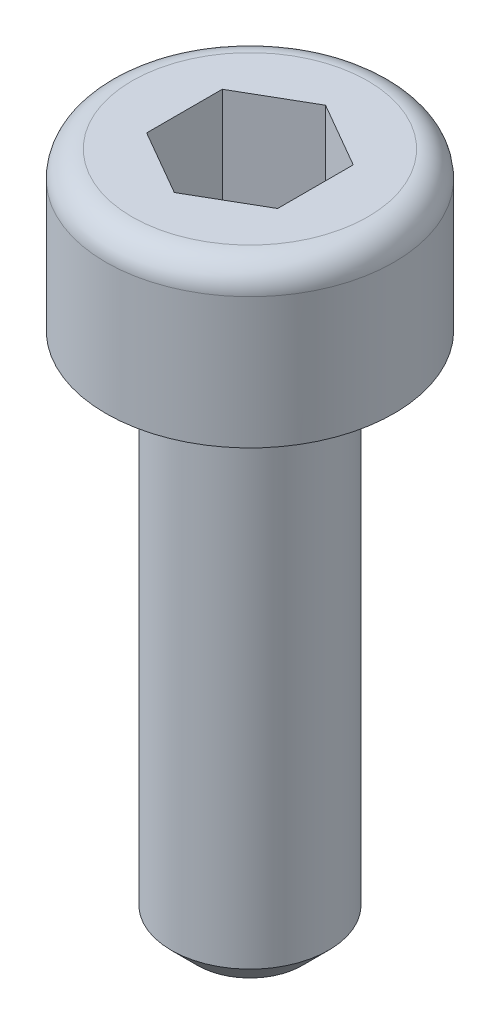
ISO-10303-21;
HEADER;
FILE_DESCRIPTION(('STEP AP214'),'2;1');
FILE_NAME('part.step','',(''),(''),'','','');
FILE_SCHEMA(('AUTOMOTIVE_DESIGN { 1 0 10303 214 1 1 1 1 }'));
ENDSEC;
DATA;
#1=APPLICATION_CONTEXT('core data for automotive mechanical design processes');
#2=APPLICATION_PROTOCOL_DEFINITION('international standard','automotive_design',2000,#1);
#3=PRODUCT_CONTEXT('',#1,'mechanical');
#4=PRODUCT('Part','Part','',(#3));
#5=PRODUCT_RELATED_PRODUCT_CATEGORY('part','',(#4));
#6=PRODUCT_DEFINITION_FORMATION('','',#4);
#7=PRODUCT_DEFINITION_CONTEXT('part definition',#1,'design');
#8=PRODUCT_DEFINITION('design','',#6,#7);
#9=PRODUCT_DEFINITION_SHAPE('','',#8);
#10=(LENGTH_UNIT() NAMED_UNIT(*) SI_UNIT(.MILLI.,.METRE.));
#11=(NAMED_UNIT(*) PLANE_ANGLE_UNIT() SI_UNIT($,.RADIAN.));
#12=(NAMED_UNIT(*) SI_UNIT($,.STERADIAN.) SOLID_ANGLE_UNIT());
#13=UNCERTAINTY_MEASURE_WITH_UNIT(LENGTH_MEASURE(1.E-05),#10,'distance_accuracy_value','');
#14=(GEOMETRIC_REPRESENTATION_CONTEXT(3) GLOBAL_UNCERTAINTY_ASSIGNED_CONTEXT((#13)) GLOBAL_UNIT_ASSIGNED_CONTEXT((#10,
#11,#12)) REPRESENTATION_CONTEXT('',''));
#15=CARTESIAN_POINT('',(0.,0.,0.));
#16=DIRECTION('',(0.,0.,1.));
#17=DIRECTION('',(1.,0.,0.));
#18=AXIS2_PLACEMENT_3D('',#15,#16,#17);
#19=CARTESIAN_POINT('',(0.,0.,0.));
#20=DIRECTION('',(0.,-1.,0.));
#21=DIRECTION('',(0.,0.,-1.));
#22=AXIS2_PLACEMENT_3D('',#19,#20,#21);
#23=PLANE('',#22);
#24=CARTESIAN_POINT('',(0.,0.,0.));
#25=DIRECTION('',(0.,-1.,0.));
#26=DIRECTION('',(0.,0.,-1.));
#27=AXIS2_PLACEMENT_3D('',#24,#25,#26);
#28=CIRCLE('',#27,2.25);
#29=CARTESIAN_POINT('',(0.,0.,-2.25));
#30=VERTEX_POINT('',#29);
#31=EDGE_CURVE('E54',#30,#30,#28,.F.);
#32=ORIENTED_EDGE('',*,*,#31,.T.);
#33=EDGE_LOOP('',(#32));
#34=FACE_BOUND('',#33,.T.);
#35=DIRECTION('',(-0.866025403784439,0.,-0.5));
#36=VECTOR('',#35,1.);
#37=CARTESIAN_POINT('',(1.25,0.,-0.721687836487032));
#38=LINE('',#37,#36);
#39=CARTESIAN_POINT('',(1.25,0.,-0.721687836487032));
#40=VERTEX_POINT('',#39);
#41=CARTESIAN_POINT('',(0.,0.,-1.44337567297406));
#42=VERTEX_POINT('',#41);
#43=EDGE_CURVE('E135',#40,#42,#38,.T.);
#44=ORIENTED_EDGE('',*,*,#43,.F.);
#45=DIRECTION('',(0.,0.,-1.));
#46=VECTOR('',#45,1.);
#47=CARTESIAN_POINT('',(1.25,0.,0.721687836487033));
#48=LINE('',#47,#46);
#49=CARTESIAN_POINT('',(1.25,0.,0.721687836487033));
#50=VERTEX_POINT('',#49);
#51=EDGE_CURVE('E61',#50,#40,#48,.T.);
#52=ORIENTED_EDGE('',*,*,#51,.F.);
#53=DIRECTION('',(0.866025403784439,0.,-0.5));
#54=VECTOR('',#53,1.);
#55=CARTESIAN_POINT('',(0.,0.,1.44337567297406));
#56=LINE('',#55,#54);
#57=CARTESIAN_POINT('',(0.,0.,1.44337567297406));
#58=VERTEX_POINT('',#57);
#59=EDGE_CURVE('E144',#58,#50,#56,.T.);
#60=ORIENTED_EDGE('',*,*,#59,.F.);
#61=DIRECTION('',(0.866025403784439,0.,0.5));
#62=VECTOR('',#61,1.);
#63=CARTESIAN_POINT('',(-1.25,0.,0.721687836487031));
#64=LINE('',#63,#62);
#65=CARTESIAN_POINT('',(-1.25,0.,0.721687836487031));
#66=VERTEX_POINT('',#65);
#67=EDGE_CURVE('E142',#66,#58,#64,.T.);
#68=ORIENTED_EDGE('',*,*,#67,.F.);
#69=DIRECTION('',(0.,0.,1.));
#70=VECTOR('',#69,1.);
#71=CARTESIAN_POINT('',(-1.25,0.,-0.721687836487033));
#72=LINE('',#71,#70);
#73=CARTESIAN_POINT('',(-1.25,0.,-0.721687836487033));
#74=VERTEX_POINT('',#73);
#75=EDGE_CURVE('E109',#74,#66,#72,.T.);
#76=ORIENTED_EDGE('',*,*,#75,.F.);
#77=DIRECTION('',(-0.866025403784439,0.,0.5));
#78=VECTOR('',#77,1.);
#79=CARTESIAN_POINT('',(0.,0.,-1.44337567297406));
#80=LINE('',#79,#78);
#81=EDGE_CURVE('E138',#42,#74,#80,.T.);
#82=ORIENTED_EDGE('',*,*,#81,.F.);
#83=EDGE_LOOP('',(#44,#52,#60,#68,#76,#82));
#84=FACE_BOUND('',#83,.T.);
#85=ADVANCED_FACE('F46',(#34,#84),#23,.F.);
#86=CARTESIAN_POINT('',(0.,0.,0.));
#87=DIRECTION('',(0.,1.,0.));
#88=DIRECTION('',(0.,0.,1.));
#89=AXIS2_PLACEMENT_3D('',#86,#87,#88);
#90=CYLINDRICAL_SURFACE('',#89,2.75);
#91=CARTESIAN_POINT('',(0.,-0.5,0.));
#92=DIRECTION('',(0.,-1.,0.));
#93=DIRECTION('',(0.,0.,-1.));
#94=AXIS2_PLACEMENT_3D('',#91,#92,#93);
#95=CIRCLE('',#94,2.75);
#96=CARTESIAN_POINT('',(0.,-0.5,-2.75));
#97=VERTEX_POINT('',#96);
#98=EDGE_CURVE('E13',#97,#97,#95,.T.);
#99=ORIENTED_EDGE('',*,*,#98,.T.);
#100=EDGE_LOOP('',(#99));
#101=FACE_BOUND('',#100,.T.);
#102=CARTESIAN_POINT('',(0.,-3.,0.));
#103=DIRECTION('',(0.,1.,0.));
#104=DIRECTION('',(0.,0.,1.));
#105=AXIS2_PLACEMENT_3D('',#102,#103,#104);
#106=CIRCLE('',#105,2.75);
#107=CARTESIAN_POINT('',(0.,-3.,2.75));
#108=VERTEX_POINT('',#107);
#109=EDGE_CURVE('E156',#108,#108,#106,.T.);
#110=ORIENTED_EDGE('',*,*,#109,.T.);
#111=EDGE_LOOP('',(#110));
#112=FACE_BOUND('',#111,.T.);
#113=ADVANCED_FACE('F178',(#101,#112),#90,.T.);
#114=CARTESIAN_POINT('',(2.75,-3.,0.));
#115=DIRECTION('',(0.,1.,0.));
#116=DIRECTION('',(0.,0.,1.));
#117=AXIS2_PLACEMENT_3D('',#114,#115,#116);
#118=PLANE('',#117);
#119=ORIENTED_EDGE('',*,*,#109,.F.);
#120=EDGE_LOOP('',(#119));
#121=FACE_BOUND('',#120,.T.);
#122=CARTESIAN_POINT('',(0.,-3.,0.));
#123=DIRECTION('',(0.,1.,0.));
#124=DIRECTION('',(0.,0.,1.));
#125=AXIS2_PLACEMENT_3D('',#122,#123,#124);
#126=CIRCLE('',#125,1.5);
#127=CARTESIAN_POINT('',(0.,-3.,1.5));
#128=VERTEX_POINT('',#127);
#129=EDGE_CURVE('E148',#128,#128,#126,.T.);
#130=ORIENTED_EDGE('',*,*,#129,.T.);
#131=EDGE_LOOP('',(#130));
#132=FACE_BOUND('',#131,.T.);
#133=ADVANCED_FACE('F183',(#121,#132),#118,.F.);
#134=CARTESIAN_POINT('',(0.,0.,0.));
#135=DIRECTION('',(0.,1.,0.));
#136=DIRECTION('',(0.,0.,1.));
#137=AXIS2_PLACEMENT_3D('',#134,#135,#136);
#138=CYLINDRICAL_SURFACE('',#137,1.5);
#139=CARTESIAN_POINT('',(0.,-12.5,0.));
#140=DIRECTION('',(0.,1.,0.));
#141=DIRECTION('',(0.,0.,1.));
#142=AXIS2_PLACEMENT_3D('',#139,#140,#141);
#143=CIRCLE('',#142,1.5);
#144=CARTESIAN_POINT('',(0.,-12.5,1.5));
#145=VERTEX_POINT('',#144);
#146=EDGE_CURVE('E159',#145,#145,#143,.T.);
#147=ORIENTED_EDGE('',*,*,#146,.T.);
#148=EDGE_LOOP('',(#147));
#149=FACE_BOUND('',#148,.T.);
#150=ORIENTED_EDGE('',*,*,#129,.F.);
#151=EDGE_LOOP('',(#150));
#152=FACE_BOUND('',#151,.T.);
#153=ADVANCED_FACE('F189',(#149,#152),#138,.T.);
#154=CARTESIAN_POINT('',(1.5,-13.,0.));
#155=DIRECTION('',(0.,1.,0.));
#156=DIRECTION('',(0.,0.,1.));
#157=AXIS2_PLACEMENT_3D('',#154,#155,#156);
#158=PLANE('',#157);
#159=CARTESIAN_POINT('',(0.,-13.,0.));
#160=DIRECTION('',(0.,1.,0.));
#161=DIRECTION('',(0.,0.,1.));
#162=AXIS2_PLACEMENT_3D('',#159,#160,#161);
#163=CIRCLE('',#162,0.999999999999998);
#164=CARTESIAN_POINT('',(0.,-13.,0.999999999999998));
#165=VERTEX_POINT('',#164);
#166=EDGE_CURVE('E162',#165,#165,#163,.F.);
#167=ORIENTED_EDGE('',*,*,#166,.T.);
#168=EDGE_LOOP('',(#167));
#169=FACE_BOUND('',#168,.T.);
#170=ADVANCED_FACE('F193',(#169),#158,.F.);
#171=CARTESIAN_POINT('',(1.25,-2.,0.721687836487033));
#172=DIRECTION('',(1.,0.,0.));
#173=DIRECTION('',(0.,0.,-1.));
#174=AXIS2_PLACEMENT_3D('',#171,#172,#173);
#175=PLANE('',#174);
#176=ORIENTED_EDGE('',*,*,#51,.T.);
#177=DIRECTION('',(0.,1.,0.));
#178=VECTOR('',#177,1.);
#179=CARTESIAN_POINT('',(1.25,-2.,-0.721687836487032));
#180=LINE('',#179,#178);
#181=CARTESIAN_POINT('',(1.25,-2.,-0.721687836487032));
#182=VERTEX_POINT('',#181);
#183=EDGE_CURVE('E91',#182,#40,#180,.T.);
#184=ORIENTED_EDGE('',*,*,#183,.F.);
#185=DIRECTION('',(0.,0.,-1.));
#186=VECTOR('',#185,1.);
#187=CARTESIAN_POINT('',(1.25,-2.,0.721687836487033));
#188=LINE('',#187,#186);
#189=CARTESIAN_POINT('',(1.25,-2.,0.721687836487033));
#190=VERTEX_POINT('',#189);
#191=EDGE_CURVE('E146',#190,#182,#188,.T.);
#192=ORIENTED_EDGE('',*,*,#191,.F.);
#193=DIRECTION('',(0.,1.,0.));
#194=VECTOR('',#193,1.);
#195=CARTESIAN_POINT('',(1.25,-2.,0.721687836487033));
#196=LINE('',#195,#194);
#197=EDGE_CURVE('E69',#190,#50,#196,.T.);
#198=ORIENTED_EDGE('',*,*,#197,.T.);
#199=EDGE_LOOP('',(#176,#184,#192,#198));
#200=FACE_BOUND('',#199,.T.);
#201=ADVANCED_FACE('F197',(#200),#175,.F.);
#202=CARTESIAN_POINT('',(0.,-2.,1.44337567297406));
#203=DIRECTION('',(0.5,0.,0.866025403784439));
#204=DIRECTION('',(0.866025403784439,0.,-0.5));
#205=AXIS2_PLACEMENT_3D('',#202,#203,#204);
#206=PLANE('',#205);
#207=ORIENTED_EDGE('',*,*,#59,.T.);
#208=ORIENTED_EDGE('',*,*,#197,.F.);
#209=DIRECTION('',(0.866025403784439,0.,-0.5));
#210=VECTOR('',#209,1.);
#211=CARTESIAN_POINT('',(0.,-2.,1.44337567297406));
#212=LINE('',#211,#210);
#213=CARTESIAN_POINT('',(0.,-2.,1.44337567297406));
#214=VERTEX_POINT('',#213);
#215=EDGE_CURVE('E121',#214,#190,#212,.T.);
#216=ORIENTED_EDGE('',*,*,#215,.F.);
#217=DIRECTION('',(0.,1.,0.));
#218=VECTOR('',#217,1.);
#219=CARTESIAN_POINT('',(0.,-2.,1.44337567297406));
#220=LINE('',#219,#218);
#221=EDGE_CURVE('E113',#214,#58,#220,.T.);
#222=ORIENTED_EDGE('',*,*,#221,.T.);
#223=EDGE_LOOP('',(#207,#208,#216,#222));
#224=FACE_BOUND('',#223,.T.);
#225=ADVANCED_FACE('F201',(#224),#206,.F.);
#226=CARTESIAN_POINT('',(-1.25,-2.,0.721687836487031));
#227=DIRECTION('',(-0.5,0.,0.866025403784439));
#228=DIRECTION('',(0.866025403784439,0.,0.5));
#229=AXIS2_PLACEMENT_3D('',#226,#227,#228);
#230=PLANE('',#229);
#231=ORIENTED_EDGE('',*,*,#67,.T.);
#232=ORIENTED_EDGE('',*,*,#221,.F.);
#233=DIRECTION('',(0.866025403784439,0.,0.5));
#234=VECTOR('',#233,1.);
#235=CARTESIAN_POINT('',(-1.25,-2.,0.721687836487031));
#236=LINE('',#235,#234);
#237=CARTESIAN_POINT('',(-1.25,-2.,0.721687836487031));
#238=VERTEX_POINT('',#237);
#239=EDGE_CURVE('E117',#238,#214,#236,.T.);
#240=ORIENTED_EDGE('',*,*,#239,.F.);
#241=DIRECTION('',(0.,1.,0.));
#242=VECTOR('',#241,1.);
#243=CARTESIAN_POINT('',(-1.25,-2.,0.721687836487031));
#244=LINE('',#243,#242);
#245=EDGE_CURVE('E102',#238,#66,#244,.T.);
#246=ORIENTED_EDGE('',*,*,#245,.T.);
#247=EDGE_LOOP('',(#231,#232,#240,#246));
#248=FACE_BOUND('',#247,.T.);
#249=ADVANCED_FACE('F118',(#248),#230,.F.);
#250=CARTESIAN_POINT('',(-1.25,-2.,-0.721687836487033));
#251=DIRECTION('',(-1.,0.,0.));
#252=DIRECTION('',(0.,0.,1.));
#253=AXIS2_PLACEMENT_3D('',#250,#251,#252);
#254=PLANE('',#253);
#255=ORIENTED_EDGE('',*,*,#75,.T.);
#256=ORIENTED_EDGE('',*,*,#245,.F.);
#257=DIRECTION('',(0.,0.,1.));
#258=VECTOR('',#257,1.);
#259=CARTESIAN_POINT('',(-1.25,-2.,-0.721687836487033));
#260=LINE('',#259,#258);
#261=CARTESIAN_POINT('',(-1.25,-2.,-0.721687836487033));
#262=VERTEX_POINT('',#261);
#263=EDGE_CURVE('E106',#262,#238,#260,.T.);
#264=ORIENTED_EDGE('',*,*,#263,.F.);
#265=DIRECTION('',(0.,1.,0.));
#266=VECTOR('',#265,1.);
#267=CARTESIAN_POINT('',(-1.25,-2.,-0.721687836487033));
#268=LINE('',#267,#266);
#269=EDGE_CURVE('E114',#262,#74,#268,.T.);
#270=ORIENTED_EDGE('',*,*,#269,.T.);
#271=EDGE_LOOP('',(#255,#256,#264,#270));
#272=FACE_BOUND('',#271,.T.);
#273=ADVANCED_FACE('F104',(#272),#254,.F.);
#274=CARTESIAN_POINT('',(0.,-2.,-1.44337567297406));
#275=DIRECTION('',(-0.5,0.,-0.866025403784439));
#276=DIRECTION('',(-0.866025403784439,0.,0.5));
#277=AXIS2_PLACEMENT_3D('',#274,#275,#276);
#278=PLANE('',#277);
#279=ORIENTED_EDGE('',*,*,#81,.T.);
#280=ORIENTED_EDGE('',*,*,#269,.F.);
#281=DIRECTION('',(-0.866025403784439,0.,0.5));
#282=VECTOR('',#281,1.);
#283=CARTESIAN_POINT('',(0.,-2.,-1.44337567297406));
#284=LINE('',#283,#282);
#285=CARTESIAN_POINT('',(0.,-2.,-1.44337567297406));
#286=VERTEX_POINT('',#285);
#287=EDGE_CURVE('E127',#286,#262,#284,.T.);
#288=ORIENTED_EDGE('',*,*,#287,.F.);
#289=DIRECTION('',(0.,1.,0.));
#290=VECTOR('',#289,1.);
#291=CARTESIAN_POINT('',(0.,-2.,-1.44337567297406));
#292=LINE('',#291,#290);
#293=EDGE_CURVE('E151',#286,#42,#292,.T.);
#294=ORIENTED_EDGE('',*,*,#293,.T.);
#295=EDGE_LOOP('',(#279,#280,#288,#294));
#296=FACE_BOUND('',#295,.T.);
#297=ADVANCED_FACE('F205',(#296),#278,.F.);
#298=CARTESIAN_POINT('',(1.25,-2.,-0.721687836487032));
#299=DIRECTION('',(0.5,0.,-0.866025403784439));
#300=DIRECTION('',(-0.866025403784439,0.,-0.5));
#301=AXIS2_PLACEMENT_3D('',#298,#299,#300);
#302=PLANE('',#301);
#303=ORIENTED_EDGE('',*,*,#43,.T.);
#304=ORIENTED_EDGE('',*,*,#293,.F.);
#305=DIRECTION('',(-0.866025403784439,0.,-0.5));
#306=VECTOR('',#305,1.);
#307=CARTESIAN_POINT('',(1.25,-2.,-0.721687836487032));
#308=LINE('',#307,#306);
#309=EDGE_CURVE('E129',#182,#286,#308,.T.);
#310=ORIENTED_EDGE('',*,*,#309,.F.);
#311=ORIENTED_EDGE('',*,*,#183,.T.);
#312=EDGE_LOOP('',(#303,#304,#310,#311));
#313=FACE_BOUND('',#312,.T.);
#314=ADVANCED_FACE('F202',(#313),#302,.F.);
#315=CARTESIAN_POINT('',(1.25,-2.,-0.721687836487032));
#316=DIRECTION('',(0.,1.,0.));
#317=DIRECTION('',(0.,0.,1.));
#318=AXIS2_PLACEMENT_3D('',#315,#316,#317);
#319=PLANE('',#318);
#320=ORIENTED_EDGE('',*,*,#191,.T.);
#321=ORIENTED_EDGE('',*,*,#309,.T.);
#322=ORIENTED_EDGE('',*,*,#287,.T.);
#323=ORIENTED_EDGE('',*,*,#263,.T.);
#324=ORIENTED_EDGE('',*,*,#239,.T.);
#325=ORIENTED_EDGE('',*,*,#215,.T.);
#326=EDGE_LOOP('',(#320,#321,#322,#323,#324,#325));
#327=FACE_BOUND('',#326,.T.);
#328=ADVANCED_FACE('F124',(#327),#319,.T.);
#329=CARTESIAN_POINT('',(0.,-12.5,0.));
#330=DIRECTION('',(0.,1.,0.));
#331=DIRECTION('',(0.,0.,1.));
#332=AXIS2_PLACEMENT_3D('',#329,#330,#331);
#333=CONICAL_SURFACE('',#332,1.5,0.785398163397451);
#334=ORIENTED_EDGE('',*,*,#166,.F.);
#335=EDGE_LOOP('',(#334));
#336=FACE_BOUND('',#335,.T.);
#337=ORIENTED_EDGE('',*,*,#146,.F.);
#338=EDGE_LOOP('',(#337));
#339=FACE_BOUND('',#338,.T.);
#340=ADVANCED_FACE('F170',(#336,#339),#333,.T.);
#341=CARTESIAN_POINT('',(0.,-0.5,0.));
#342=DIRECTION('',(0.,-1.,0.));
#343=DIRECTION('',(0.,0.,-1.));
#344=AXIS2_PLACEMENT_3D('',#341,#342,#343);
#345=TOROIDAL_SURFACE('',#344,2.25,0.5);
#346=ORIENTED_EDGE('',*,*,#98,.F.);
#347=EDGE_LOOP('',(#346));
#348=FACE_BOUND('',#347,.T.);
#349=ORIENTED_EDGE('',*,*,#31,.F.);
#350=EDGE_LOOP('',(#349));
#351=FACE_BOUND('',#350,.T.);
#352=ADVANCED_FACE('F48',(#348,#351),#345,.T.);
#353=CLOSED_SHELL('',(#85,#113,#133,#153,#170,#201,#225,#249,#273,#297,#314,#328,#340,#352));
#354=MANIFOLD_SOLID_BREP('B2',#353);
#355=ADVANCED_BREP_SHAPE_REPRESENTATION('',(#18,#354),#14);
#356=SHAPE_DEFINITION_REPRESENTATION(#9,#355);
ENDSEC;
END-ISO-10303-21;
